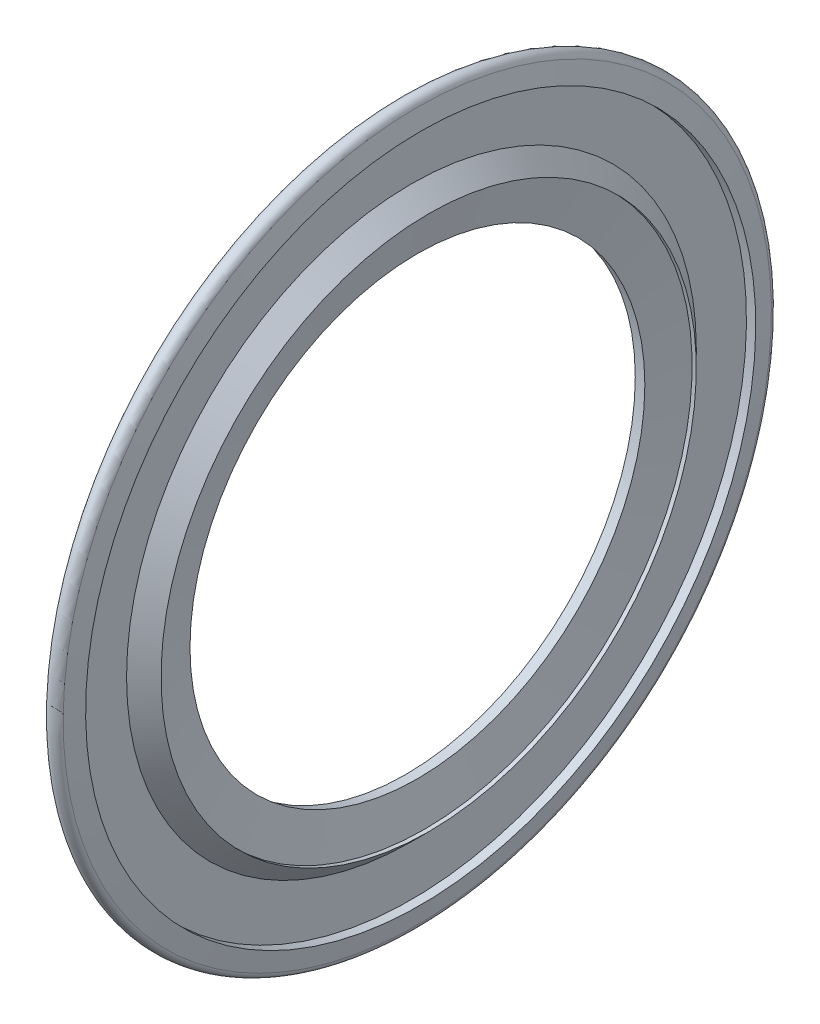
ISO-10303-21;
HEADER;
FILE_DESCRIPTION(('STEP AP214'),'2;1');
FILE_NAME('part.step','',(''),(''),'','','');
FILE_SCHEMA(('AUTOMOTIVE_DESIGN { 1 0 10303 214 1 1 1 1 }'));
ENDSEC;
DATA;
#1=APPLICATION_CONTEXT('core data for automotive mechanical design processes');
#2=APPLICATION_PROTOCOL_DEFINITION('international standard','automotive_design',2000,#1);
#3=PRODUCT_CONTEXT('',#1,'mechanical');
#4=PRODUCT('Part','Part','',(#3));
#5=PRODUCT_RELATED_PRODUCT_CATEGORY('part','',(#4));
#6=PRODUCT_DEFINITION_FORMATION('','',#4);
#7=PRODUCT_DEFINITION_CONTEXT('part definition',#1,'design');
#8=PRODUCT_DEFINITION('design','',#6,#7);
#9=PRODUCT_DEFINITION_SHAPE('','',#8);
#10=(LENGTH_UNIT() NAMED_UNIT(*) SI_UNIT(.MILLI.,.METRE.));
#11=(NAMED_UNIT(*) PLANE_ANGLE_UNIT() SI_UNIT($,.RADIAN.));
#12=(NAMED_UNIT(*) SI_UNIT($,.STERADIAN.) SOLID_ANGLE_UNIT());
#13=UNCERTAINTY_MEASURE_WITH_UNIT(LENGTH_MEASURE(1.E-05),#10,'distance_accuracy_value','');
#14=(GEOMETRIC_REPRESENTATION_CONTEXT(3) GLOBAL_UNCERTAINTY_ASSIGNED_CONTEXT((#13)) GLOBAL_UNIT_ASSIGNED_CONTEXT((#10,
#11,#12)) REPRESENTATION_CONTEXT('',''));
#15=CARTESIAN_POINT('',(0.,0.,0.));
#16=DIRECTION('',(0.,0.,1.));
#17=DIRECTION('',(1.,0.,0.));
#18=AXIS2_PLACEMENT_3D('',#15,#16,#17);
#19=CARTESIAN_POINT('',(0.5175,0.,0.));
#20=DIRECTION('',(-1.,0.,0.));
#21=DIRECTION('',(0.,1.,0.));
#22=AXIS2_PLACEMENT_3D('',#19,#20,#21);
#23=CONICAL_SURFACE('',#22,9.13890156971464,0.174532925199432);
#24=CARTESIAN_POINT('',(0.75,0.,0.));
#25=DIRECTION('',(1.,0.,0.));
#26=DIRECTION('',(0.,1.,0.));
#27=AXIS2_PLACEMENT_3D('',#24,#25,#26);
#28=CIRCLE('',#27,9.09790554669992);
#29=CARTESIAN_POINT('',(0.75,9.09790554669992,0.));
#30=VERTEX_POINT('',#29);
#31=EDGE_CURVE('E11',#30,#30,#28,.T.);
#32=ORIENTED_EDGE('',*,*,#31,.T.);
#33=EDGE_LOOP('',(#32));
#34=FACE_BOUND('',#33,.T.);
#35=CARTESIAN_POINT('',(0.285,0.,0.));
#36=DIRECTION('',(1.,0.,0.));
#37=DIRECTION('',(0.,1.,0.));
#38=AXIS2_PLACEMENT_3D('',#35,#36,#37);
#39=CIRCLE('',#38,9.17989759272936);
#40=CARTESIAN_POINT('',(0.285,9.17989759272936,0.));
#41=VERTEX_POINT('',#40);
#42=EDGE_CURVE('E81',#41,#41,#39,.T.);
#43=ORIENTED_EDGE('',*,*,#42,.F.);
#44=EDGE_LOOP('',(#43));
#45=FACE_BOUND('',#44,.T.);
#46=ADVANCED_FACE('F17',(#34,#45),#23,.F.);
#47=CARTESIAN_POINT('',(0.891731138077039,0.,0.));
#48=DIRECTION('',(1.,0.,0.));
#49=DIRECTION('',(0.,1.,0.));
#50=AXIS2_PLACEMENT_3D('',#47,#48,#49);
#51=CONICAL_SURFACE('',#50,9.90170277334996,1.39626340159546);
#52=CARTESIAN_POINT('',(1.03346227615408,0.,0.));
#53=DIRECTION('',(1.,0.,0.));
#54=DIRECTION('',(0.,1.,0.));
#55=AXIS2_PLACEMENT_3D('',#52,#53,#54);
#56=CIRCLE('',#55,10.7055);
#57=CARTESIAN_POINT('',(1.03346227615408,10.7055,0.));
#58=VERTEX_POINT('',#57);
#59=EDGE_CURVE('E26',#58,#58,#56,.T.);
#60=ORIENTED_EDGE('',*,*,#59,.T.);
#61=EDGE_LOOP('',(#60));
#62=FACE_BOUND('',#61,.T.);
#63=ORIENTED_EDGE('',*,*,#31,.F.);
#64=EDGE_LOOP('',(#63));
#65=FACE_BOUND('',#64,.T.);
#66=ADVANCED_FACE('F103',(#62,#65),#51,.F.);
#67=CARTESIAN_POINT('',(1.11673113807704,0.,0.));
#68=DIRECTION('',(-1.,0.,0.));
#69=DIRECTION('',(0.,1.,0.));
#70=AXIS2_PLACEMENT_3D('',#67,#68,#69);
#71=CYLINDRICAL_SURFACE('',#70,10.7055);
#72=CARTESIAN_POINT('',(1.2,0.,0.));
#73=DIRECTION('',(1.,0.,0.));
#74=DIRECTION('',(0.,1.,0.));
#75=AXIS2_PLACEMENT_3D('',#72,#73,#74);
#76=CIRCLE('',#75,10.7055);
#77=CARTESIAN_POINT('',(1.2,10.7055,0.));
#78=VERTEX_POINT('',#77);
#79=EDGE_CURVE('E72',#78,#78,#76,.T.);
#80=ORIENTED_EDGE('',*,*,#79,.T.);
#81=EDGE_LOOP('',(#80));
#82=FACE_BOUND('',#81,.T.);
#83=ORIENTED_EDGE('',*,*,#59,.F.);
#84=EDGE_LOOP('',(#83));
#85=FACE_BOUND('',#84,.T.);
#86=ADVANCED_FACE('F108',(#82,#85),#71,.F.);
#87=CARTESIAN_POINT('',(0.855,0.,0.));
#88=DIRECTION('',(-1.,0.,0.));
#89=DIRECTION('',(0.,1.,0.));
#90=AXIS2_PLACEMENT_3D('',#87,#88,#89);
#91=CONICAL_SURFACE('',#90,11.0505,0.785398163397449);
#92=CARTESIAN_POINT('',(0.51,0.,0.));
#93=DIRECTION('',(1.,0.,0.));
#94=DIRECTION('',(0.,1.,0.));
#95=AXIS2_PLACEMENT_3D('',#92,#93,#94);
#96=CIRCLE('',#95,11.3955);
#97=CARTESIAN_POINT('',(0.51,11.3955,0.));
#98=VERTEX_POINT('',#97);
#99=EDGE_CURVE('E69',#98,#98,#96,.T.);
#100=ORIENTED_EDGE('',*,*,#99,.T.);
#101=EDGE_LOOP('',(#100));
#102=FACE_BOUND('',#101,.T.);
#103=ORIENTED_EDGE('',*,*,#79,.F.);
#104=EDGE_LOOP('',(#103));
#105=FACE_BOUND('',#104,.T.);
#106=ADVANCED_FACE('F115',(#102,#105),#91,.T.);
#107=CARTESIAN_POINT('',(0.51,12.399195,0.));
#108=DIRECTION('',(1.,0.,0.));
#109=DIRECTION('',(0.,1.,0.));
#110=AXIS2_PLACEMENT_3D('',#107,#108,#109);
#111=PLANE('',#110);
#112=CARTESIAN_POINT('',(0.51,0.,0.));
#113=DIRECTION('',(1.,0.,0.));
#114=DIRECTION('',(0.,1.,0.));
#115=AXIS2_PLACEMENT_3D('',#112,#113,#114);
#116=CIRCLE('',#115,13.40289);
#117=CARTESIAN_POINT('',(0.51,13.40289,0.));
#118=VERTEX_POINT('',#117);
#119=EDGE_CURVE('E67',#118,#118,#116,.T.);
#120=ORIENTED_EDGE('',*,*,#119,.T.);
#121=EDGE_LOOP('',(#120));
#122=FACE_BOUND('',#121,.T.);
#123=ORIENTED_EDGE('',*,*,#99,.F.);
#124=EDGE_LOOP('',(#123));
#125=FACE_BOUND('',#124,.T.);
#126=ADVANCED_FACE('F117',(#122,#125),#111,.T.);
#127=CARTESIAN_POINT('',(0.695016747757696,0.,0.));
#128=DIRECTION('',(-1.,0.,0.));
#129=DIRECTION('',(0.,1.,0.));
#130=AXIS2_PLACEMENT_3D('',#127,#128,#129);
#131=CYLINDRICAL_SURFACE('',#130,13.40289);
#132=CARTESIAN_POINT('',(0.880033495515391,0.,0.));
#133=DIRECTION('',(1.,0.,0.));
#134=DIRECTION('',(0.,1.,0.));
#135=AXIS2_PLACEMENT_3D('',#132,#133,#134);
#136=CIRCLE('',#135,13.40289);
#137=CARTESIAN_POINT('',(0.880033495515391,13.40289,0.));
#138=VERTEX_POINT('',#137);
#139=EDGE_CURVE('E223',#138,#138,#136,.T.);
#140=ORIENTED_EDGE('',*,*,#139,.T.);
#141=EDGE_LOOP('',(#140));
#142=FACE_BOUND('',#141,.T.);
#143=ORIENTED_EDGE('',*,*,#119,.F.);
#144=EDGE_LOOP('',(#143));
#145=FACE_BOUND('',#144,.T.);
#146=ADVANCED_FACE('F112',(#142,#145),#131,.F.);
#147=CARTESIAN_POINT('',(0.812737910709527,0.,0.));
#148=DIRECTION('',(-1.,0.,0.));
#149=DIRECTION('',(0.,1.,0.));
#150=AXIS2_PLACEMENT_3D('',#147,#148,#149);
#151=CONICAL_SURFACE('',#150,13.78454222665,1.39626340159546);
#152=CARTESIAN_POINT('',(0.745442325903663,0.,0.));
#153=DIRECTION('',(1.,0.,0.));
#154=DIRECTION('',(0.,1.,0.));
#155=AXIS2_PLACEMENT_3D('',#152,#153,#154);
#156=CIRCLE('',#155,14.1661944533001);
#157=CARTESIAN_POINT('',(0.745442325903663,14.1661944533001,0.));
#158=VERTEX_POINT('',#157);
#159=EDGE_CURVE('E62',#158,#158,#156,.T.);
#160=ORIENTED_EDGE('',*,*,#159,.T.);
#161=EDGE_LOOP('',(#160));
#162=FACE_BOUND('',#161,.T.);
#163=ORIENTED_EDGE('',*,*,#139,.F.);
#164=EDGE_LOOP('',(#163));
#165=FACE_BOUND('',#164,.T.);
#166=ADVANCED_FACE('F127',(#162,#165),#151,.T.);
#167=CARTESIAN_POINT('',(0.45,0.,0.));
#168=DIRECTION('',(1.,0.,0.));
#169=DIRECTION('',(0.,0.,-1.));
#170=AXIS2_PLACEMENT_3D('',#167,#168,#169);
#171=TOROIDAL_SURFACE('',#170,14.1141,0.3);
#172=CARTESIAN_POINT('',(0.190192378864668,0.,0.));
#173=DIRECTION('',(1.,0.,0.));
#174=DIRECTION('',(0.,1.,0.));
#175=AXIS2_PLACEMENT_3D('',#172,#173,#174);
#176=CIRCLE('',#175,14.2641);
#177=CARTESIAN_POINT('',(0.190192378864668,14.2641,0.));
#178=VERTEX_POINT('',#177);
#179=EDGE_CURVE('E59',#178,#178,#176,.T.);
#180=ORIENTED_EDGE('',*,*,#179,.T.);
#181=EDGE_LOOP('',(#180));
#182=FACE_BOUND('',#181,.T.);
#183=ORIENTED_EDGE('',*,*,#159,.F.);
#184=EDGE_LOOP('',(#183));
#185=FACE_BOUND('',#184,.T.);
#186=ADVANCED_FACE('F120',(#182,#185),#171,.T.);
#187=CARTESIAN_POINT('',(0.190192378864668,14.0241,0.));
#188=DIRECTION('',(-1.,0.,0.));
#189=DIRECTION('',(0.,-1.,0.));
#190=AXIS2_PLACEMENT_3D('',#187,#188,#189);
#191=PLANE('',#190);
#192=CARTESIAN_POINT('',(0.190192378864668,0.,0.));
#193=DIRECTION('',(1.,0.,0.));
#194=DIRECTION('',(0.,1.,0.));
#195=AXIS2_PLACEMENT_3D('',#192,#193,#194);
#196=CIRCLE('',#195,13.7841);
#197=CARTESIAN_POINT('',(0.190192378864668,13.7841,0.));
#198=VERTEX_POINT('',#197);
#199=EDGE_CURVE('E55',#198,#198,#196,.T.);
#200=ORIENTED_EDGE('',*,*,#199,.T.);
#201=EDGE_LOOP('',(#200));
#202=FACE_BOUND('',#201,.T.);
#203=ORIENTED_EDGE('',*,*,#179,.F.);
#204=EDGE_LOOP('',(#203));
#205=FACE_BOUND('',#204,.T.);
#206=ADVANCED_FACE('F56',(#202,#205),#191,.T.);
#207=CARTESIAN_POINT('',(0.125096189432335,0.,0.));
#208=DIRECTION('',(1.,0.,0.));
#209=DIRECTION('',(0.,1.,0.));
#210=AXIS2_PLACEMENT_3D('',#207,#208,#209);
#211=CONICAL_SURFACE('',#210,13.7190038105677,0.785398163397438);
#212=CARTESIAN_POINT('',(0.0600000000000007,0.,0.));
#213=DIRECTION('',(1.,0.,0.));
#214=DIRECTION('',(0.,1.,0.));
#215=AXIS2_PLACEMENT_3D('',#212,#213,#214);
#216=CIRCLE('',#215,13.6539076211353);
#217=CARTESIAN_POINT('',(0.0600000000000007,13.6539076211353,0.));
#218=VERTEX_POINT('',#217);
#219=EDGE_CURVE('E60',#218,#218,#216,.T.);
#220=ORIENTED_EDGE('',*,*,#219,.T.);
#221=EDGE_LOOP('',(#220));
#222=FACE_BOUND('',#221,.T.);
#223=ORIENTED_EDGE('',*,*,#199,.F.);
#224=EDGE_LOOP('',(#223));
#225=FACE_BOUND('',#224,.T.);
#226=ADVANCED_FACE('F99',(#222,#225),#211,.T.);
#227=CARTESIAN_POINT('',(0.06,12.1797038105677,0.));
#228=DIRECTION('',(-1.,0.,0.));
#229=DIRECTION('',(0.,-1.,0.));
#230=AXIS2_PLACEMENT_3D('',#227,#228,#229);
#231=PLANE('',#230);
#232=CARTESIAN_POINT('',(0.06,0.,0.));
#233=DIRECTION('',(1.,0.,0.));
#234=DIRECTION('',(0.,1.,0.));
#235=AXIS2_PLACEMENT_3D('',#232,#233,#234);
#236=CIRCLE('',#235,10.7055);
#237=CARTESIAN_POINT('',(0.06,10.7055,0.));
#238=VERTEX_POINT('',#237);
#239=EDGE_CURVE('E63',#238,#238,#236,.T.);
#240=ORIENTED_EDGE('',*,*,#239,.T.);
#241=EDGE_LOOP('',(#240));
#242=FACE_BOUND('',#241,.T.);
#243=ORIENTED_EDGE('',*,*,#219,.F.);
#244=EDGE_LOOP('',(#243));
#245=FACE_BOUND('',#244,.T.);
#246=ADVANCED_FACE('F86',(#242,#245),#231,.T.);
#247=CARTESIAN_POINT('',(0.1725,0.,0.));
#248=DIRECTION('',(-1.,0.,0.));
#249=DIRECTION('',(0.,1.,0.));
#250=AXIS2_PLACEMENT_3D('',#247,#248,#249);
#251=CYLINDRICAL_SURFACE('',#250,10.7055);
#252=CARTESIAN_POINT('',(0.285,0.,0.));
#253=DIRECTION('',(1.,0.,0.));
#254=DIRECTION('',(0.,1.,0.));
#255=AXIS2_PLACEMENT_3D('',#252,#253,#254);
#256=CIRCLE('',#255,10.7055);
#257=CARTESIAN_POINT('',(0.285,10.7055,0.));
#258=VERTEX_POINT('',#257);
#259=EDGE_CURVE('E83',#258,#258,#256,.T.);
#260=ORIENTED_EDGE('',*,*,#259,.T.);
#261=EDGE_LOOP('',(#260));
#262=FACE_BOUND('',#261,.T.);
#263=ORIENTED_EDGE('',*,*,#239,.F.);
#264=EDGE_LOOP('',(#263));
#265=FACE_BOUND('',#264,.T.);
#266=ADVANCED_FACE('F89',(#262,#265),#251,.F.);
#267=CARTESIAN_POINT('',(0.285,9.94269879636468,0.));
#268=DIRECTION('',(-1.,0.,0.));
#269=DIRECTION('',(0.,-1.,0.));
#270=AXIS2_PLACEMENT_3D('',#267,#268,#269);
#271=PLANE('',#270);
#272=ORIENTED_EDGE('',*,*,#42,.T.);
#273=EDGE_LOOP('',(#272));
#274=FACE_BOUND('',#273,.T.);
#275=ORIENTED_EDGE('',*,*,#259,.F.);
#276=EDGE_LOOP('',(#275));
#277=FACE_BOUND('',#276,.T.);
#278=ADVANCED_FACE('F19',(#274,#277),#271,.T.);
#279=CLOSED_SHELL('',(#46,#66,#86,#106,#126,#146,#166,#186,#206,#226,#246,#266,#278));
#280=MANIFOLD_SOLID_BREP('B1',#279);
#281=ADVANCED_BREP_SHAPE_REPRESENTATION('',(#18,#280),#14);
#282=SHAPE_DEFINITION_REPRESENTATION(#9,#281);
ENDSEC;
END-ISO-10303-21;
